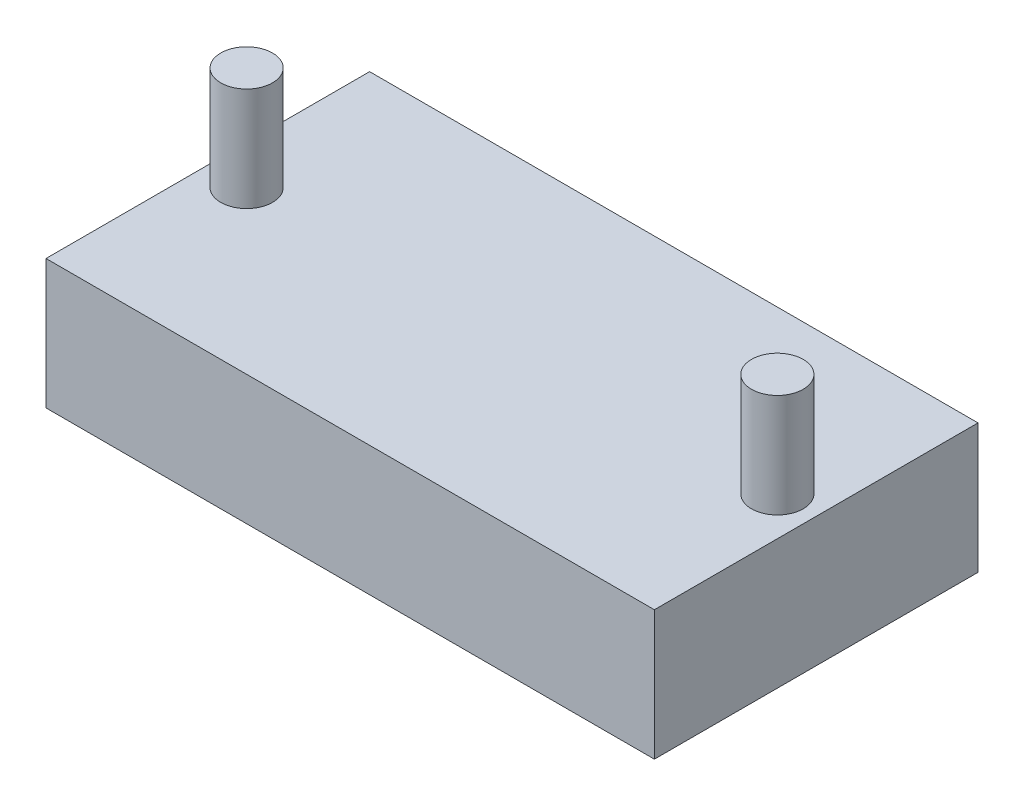
ISO-10303-21;
HEADER;
FILE_DESCRIPTION(('STEP AP214'),'2;1');
FILE_NAME('part.step','',(''),(''),'','','');
FILE_SCHEMA(('AUTOMOTIVE_DESIGN { 1 0 10303 214 1 1 1 1 }'));
ENDSEC;
DATA;
#1=APPLICATION_CONTEXT('core data for automotive mechanical design processes');
#2=APPLICATION_PROTOCOL_DEFINITION('international standard','automotive_design',2000,#1);
#3=PRODUCT_CONTEXT('',#1,'mechanical');
#4=PRODUCT('Part','Part','',(#3));
#5=PRODUCT_RELATED_PRODUCT_CATEGORY('part','',(#4));
#6=PRODUCT_DEFINITION_FORMATION('','',#4);
#7=PRODUCT_DEFINITION_CONTEXT('part definition',#1,'design');
#8=PRODUCT_DEFINITION('design','',#6,#7);
#9=PRODUCT_DEFINITION_SHAPE('','',#8);
#10=(LENGTH_UNIT() NAMED_UNIT(*) SI_UNIT(.MILLI.,.METRE.));
#11=(NAMED_UNIT(*) PLANE_ANGLE_UNIT() SI_UNIT($,.RADIAN.));
#12=(NAMED_UNIT(*) SI_UNIT($,.STERADIAN.) SOLID_ANGLE_UNIT());
#13=UNCERTAINTY_MEASURE_WITH_UNIT(LENGTH_MEASURE(1.E-05),#10,'distance_accuracy_value','');
#14=(GEOMETRIC_REPRESENTATION_CONTEXT(3) GLOBAL_UNCERTAINTY_ASSIGNED_CONTEXT((#13)) GLOBAL_UNIT_ASSIGNED_CONTEXT((#10,
#11,#12)) REPRESENTATION_CONTEXT('',''));
#15=CARTESIAN_POINT('',(0.,0.,0.));
#16=DIRECTION('',(0.,0.,1.));
#17=DIRECTION('',(1.,0.,0.));
#18=AXIS2_PLACEMENT_3D('',#15,#16,#17);
#19=CARTESIAN_POINT('',(0.,10.,0.));
#20=DIRECTION('',(1.,0.,0.));
#21=DIRECTION('',(0.,0.,-1.));
#22=AXIS2_PLACEMENT_3D('',#19,#20,#21);
#23=PLANE('',#22);
#24=DIRECTION('',(0.,0.,1.));
#25=VECTOR('',#24,1.);
#26=CARTESIAN_POINT('',(0.,0.,0.));
#27=LINE('',#26,#25);
#28=CARTESIAN_POINT('',(0.,0.,-25.));
#29=VERTEX_POINT('',#28);
#30=CARTESIAN_POINT('',(0.,0.,0.));
#31=VERTEX_POINT('',#30);
#32=EDGE_CURVE('E115',#29,#31,#27,.T.);
#33=ORIENTED_EDGE('',*,*,#32,.T.);
#34=DIRECTION('',(0.,-1.,0.));
#35=VECTOR('',#34,1.);
#36=CARTESIAN_POINT('',(0.,10.,0.));
#37=LINE('',#36,#35);
#38=CARTESIAN_POINT('',(0.,10.,0.));
#39=VERTEX_POINT('',#38);
#40=EDGE_CURVE('E104',#39,#31,#37,.T.);
#41=ORIENTED_EDGE('',*,*,#40,.F.);
#42=DIRECTION('',(0.,0.,1.));
#43=VECTOR('',#42,1.);
#44=CARTESIAN_POINT('',(0.,10.,0.));
#45=LINE('',#44,#43);
#46=CARTESIAN_POINT('',(0.,10.,-25.));
#47=VERTEX_POINT('',#46);
#48=EDGE_CURVE('E96',#47,#39,#45,.T.);
#49=ORIENTED_EDGE('',*,*,#48,.F.);
#50=DIRECTION('',(0.,-1.,0.));
#51=VECTOR('',#50,1.);
#52=CARTESIAN_POINT('',(0.,10.,-25.));
#53=LINE('',#52,#51);
#54=EDGE_CURVE('E111',#47,#29,#53,.T.);
#55=ORIENTED_EDGE('',*,*,#54,.T.);
#56=EDGE_LOOP('',(#33,#41,#49,#55));
#57=FACE_BOUND('',#56,.T.);
#58=ADVANCED_FACE('F43',(#57),#23,.F.);
#59=CARTESIAN_POINT('',(0.,10.,0.));
#60=DIRECTION('',(0.,0.,-1.));
#61=DIRECTION('',(-1.,0.,0.));
#62=AXIS2_PLACEMENT_3D('',#59,#60,#61);
#63=PLANE('',#62);
#64=DIRECTION('',(1.,0.,0.));
#65=VECTOR('',#64,1.);
#66=CARTESIAN_POINT('',(0.,0.,0.));
#67=LINE('',#66,#65);
#68=CARTESIAN_POINT('',(47.,0.,0.));
#69=VERTEX_POINT('',#68);
#70=EDGE_CURVE('E102',#31,#69,#67,.T.);
#71=ORIENTED_EDGE('',*,*,#70,.T.);
#72=DIRECTION('',(0.,-1.,0.));
#73=VECTOR('',#72,1.);
#74=CARTESIAN_POINT('',(47.,10.,0.));
#75=LINE('',#74,#73);
#76=CARTESIAN_POINT('',(47.,10.,0.));
#77=VERTEX_POINT('',#76);
#78=EDGE_CURVE('E100',#77,#69,#75,.T.);
#79=ORIENTED_EDGE('',*,*,#78,.F.);
#80=DIRECTION('',(1.,0.,0.));
#81=VECTOR('',#80,1.);
#82=CARTESIAN_POINT('',(0.,10.,0.));
#83=LINE('',#82,#81);
#84=EDGE_CURVE('E91',#39,#77,#83,.T.);
#85=ORIENTED_EDGE('',*,*,#84,.F.);
#86=ORIENTED_EDGE('',*,*,#40,.T.);
#87=EDGE_LOOP('',(#71,#79,#85,#86));
#88=FACE_BOUND('',#87,.T.);
#89=ADVANCED_FACE('F101',(#88),#63,.F.);
#90=CARTESIAN_POINT('',(47.,10.,0.));
#91=DIRECTION('',(-1.,0.,0.));
#92=DIRECTION('',(0.,0.,1.));
#93=AXIS2_PLACEMENT_3D('',#90,#91,#92);
#94=PLANE('',#93);
#95=DIRECTION('',(0.,0.,-1.));
#96=VECTOR('',#95,1.);
#97=CARTESIAN_POINT('',(47.,0.,0.));
#98=LINE('',#97,#96);
#99=CARTESIAN_POINT('',(47.,0.,-25.));
#100=VERTEX_POINT('',#99);
#101=EDGE_CURVE('E77',#69,#100,#98,.T.);
#102=ORIENTED_EDGE('',*,*,#101,.T.);
#103=DIRECTION('',(0.,-1.,0.));
#104=VECTOR('',#103,1.);
#105=CARTESIAN_POINT('',(47.,10.,-25.));
#106=LINE('',#105,#104);
#107=CARTESIAN_POINT('',(47.,10.,-25.));
#108=VERTEX_POINT('',#107);
#109=EDGE_CURVE('E105',#108,#100,#106,.T.);
#110=ORIENTED_EDGE('',*,*,#109,.F.);
#111=DIRECTION('',(0.,0.,-1.));
#112=VECTOR('',#111,1.);
#113=CARTESIAN_POINT('',(47.,10.,0.));
#114=LINE('',#113,#112);
#115=EDGE_CURVE('E94',#77,#108,#114,.T.);
#116=ORIENTED_EDGE('',*,*,#115,.F.);
#117=ORIENTED_EDGE('',*,*,#78,.T.);
#118=EDGE_LOOP('',(#102,#110,#116,#117));
#119=FACE_BOUND('',#118,.T.);
#120=ADVANCED_FACE('F107',(#119),#94,.F.);
#121=CARTESIAN_POINT('',(0.,10.,-25.));
#122=DIRECTION('',(0.,0.,1.));
#123=DIRECTION('',(1.,0.,0.));
#124=AXIS2_PLACEMENT_3D('',#121,#122,#123);
#125=PLANE('',#124);
#126=DIRECTION('',(-1.,0.,0.));
#127=VECTOR('',#126,1.);
#128=CARTESIAN_POINT('',(0.,0.,-25.));
#129=LINE('',#128,#127);
#130=EDGE_CURVE('E83',#100,#29,#129,.T.);
#131=ORIENTED_EDGE('',*,*,#130,.T.);
#132=ORIENTED_EDGE('',*,*,#54,.F.);
#133=DIRECTION('',(-1.,0.,0.));
#134=VECTOR('',#133,1.);
#135=CARTESIAN_POINT('',(0.,10.,-25.));
#136=LINE('',#135,#134);
#137=EDGE_CURVE('E60',#108,#47,#136,.T.);
#138=ORIENTED_EDGE('',*,*,#137,.F.);
#139=ORIENTED_EDGE('',*,*,#109,.T.);
#140=EDGE_LOOP('',(#131,#132,#138,#139));
#141=FACE_BOUND('',#140,.T.);
#142=ADVANCED_FACE('F139',(#141),#125,.F.);
#143=CARTESIAN_POINT('',(0.,10.,0.));
#144=DIRECTION('',(0.,-1.,0.));
#145=DIRECTION('',(0.,0.,-1.));
#146=AXIS2_PLACEMENT_3D('',#143,#144,#145);
#147=PLANE('',#146);
#148=CARTESIAN_POINT('',(44.,10.,-12.5));
#149=DIRECTION('',(0.,-1.,0.));
#150=DIRECTION('',(0.,0.,-1.));
#151=AXIS2_PLACEMENT_3D('',#148,#149,#150);
#152=CIRCLE('',#151,2.);
#153=CARTESIAN_POINT('',(44.,10.,-14.5));
#154=VERTEX_POINT('',#153);
#155=EDGE_CURVE('E11',#154,#154,#152,.F.);
#156=ORIENTED_EDGE('',*,*,#155,.F.);
#157=EDGE_LOOP('',(#156));
#158=FACE_BOUND('',#157,.T.);
#159=CARTESIAN_POINT('',(3.,10.,-12.5));
#160=DIRECTION('',(0.,-1.,0.));
#161=DIRECTION('',(0.,0.,-1.));
#162=AXIS2_PLACEMENT_3D('',#159,#160,#161);
#163=CIRCLE('',#162,2.);
#164=CARTESIAN_POINT('',(3.,10.,-14.5));
#165=VERTEX_POINT('',#164);
#166=EDGE_CURVE('E52',#165,#165,#163,.F.);
#167=ORIENTED_EDGE('',*,*,#166,.F.);
#168=EDGE_LOOP('',(#167));
#169=FACE_BOUND('',#168,.T.);
#170=ORIENTED_EDGE('',*,*,#48,.T.);
#171=ORIENTED_EDGE('',*,*,#84,.T.);
#172=ORIENTED_EDGE('',*,*,#115,.T.);
#173=ORIENTED_EDGE('',*,*,#137,.T.);
#174=EDGE_LOOP('',(#170,#171,#172,#173));
#175=FACE_BOUND('',#174,.T.);
#176=ADVANCED_FACE('F92',(#158,#169,#175),#147,.F.);
#177=CARTESIAN_POINT('',(0.,0.,0.));
#178=DIRECTION('',(0.,-1.,0.));
#179=DIRECTION('',(0.,0.,-1.));
#180=AXIS2_PLACEMENT_3D('',#177,#178,#179);
#181=PLANE('',#180);
#182=ORIENTED_EDGE('',*,*,#32,.F.);
#183=ORIENTED_EDGE('',*,*,#130,.F.);
#184=ORIENTED_EDGE('',*,*,#101,.F.);
#185=ORIENTED_EDGE('',*,*,#70,.F.);
#186=EDGE_LOOP('',(#182,#183,#184,#185));
#187=FACE_BOUND('',#186,.T.);
#188=ADVANCED_FACE('F138',(#187),#181,.T.);
#189=CARTESIAN_POINT('',(3.,18.,-12.5));
#190=DIRECTION('',(0.,-1.,0.));
#191=DIRECTION('',(0.,0.,-1.));
#192=AXIS2_PLACEMENT_3D('',#189,#190,#191);
#193=CYLINDRICAL_SURFACE('',#192,2.);
#194=CARTESIAN_POINT('',(3.,18.,-12.5));
#195=DIRECTION('',(0.,1.,0.));
#196=DIRECTION('',(0.,0.,1.));
#197=AXIS2_PLACEMENT_3D('',#194,#195,#196);
#198=CIRCLE('',#197,2.);
#199=CARTESIAN_POINT('',(3.,18.,-10.5));
#200=VERTEX_POINT('',#199);
#201=EDGE_CURVE('E119',#200,#200,#198,.T.);
#202=ORIENTED_EDGE('',*,*,#201,.F.);
#203=EDGE_LOOP('',(#202));
#204=FACE_BOUND('',#203,.T.);
#205=ORIENTED_EDGE('',*,*,#166,.T.);
#206=EDGE_LOOP('',(#205));
#207=FACE_BOUND('',#206,.T.);
#208=ADVANCED_FACE('F135',(#204,#207),#193,.T.);
#209=CARTESIAN_POINT('',(3.,18.,-12.5));
#210=DIRECTION('',(0.,1.,0.));
#211=DIRECTION('',(0.,0.,1.));
#212=AXIS2_PLACEMENT_3D('',#209,#210,#211);
#213=PLANE('',#212);
#214=ORIENTED_EDGE('',*,*,#201,.T.);
#215=EDGE_LOOP('',(#214));
#216=FACE_BOUND('',#215,.T.);
#217=ADVANCED_FACE('F172',(#216),#213,.T.);
#218=CARTESIAN_POINT('',(44.,18.,-12.5));
#219=DIRECTION('',(0.,-1.,0.));
#220=DIRECTION('',(0.,0.,-1.));
#221=AXIS2_PLACEMENT_3D('',#218,#219,#220);
#222=CYLINDRICAL_SURFACE('',#221,2.);
#223=CARTESIAN_POINT('',(44.,18.,-12.5));
#224=DIRECTION('',(0.,1.,0.));
#225=DIRECTION('',(0.,0.,-1.));
#226=AXIS2_PLACEMENT_3D('',#223,#224,#225);
#227=CIRCLE('',#226,2.);
#228=CARTESIAN_POINT('',(44.,18.,-14.5));
#229=VERTEX_POINT('',#228);
#230=EDGE_CURVE('E162',#229,#229,#227,.T.);
#231=ORIENTED_EDGE('',*,*,#230,.F.);
#232=EDGE_LOOP('',(#231));
#233=FACE_BOUND('',#232,.T.);
#234=ORIENTED_EDGE('',*,*,#155,.T.);
#235=EDGE_LOOP('',(#234));
#236=FACE_BOUND('',#235,.T.);
#237=ADVANCED_FACE('F169',(#233,#236),#222,.T.);
#238=CARTESIAN_POINT('',(44.,18.,-12.5));
#239=DIRECTION('',(0.,-1.,0.));
#240=DIRECTION('',(0.,0.,-1.));
#241=AXIS2_PLACEMENT_3D('',#238,#239,#240);
#242=PLANE('',#241);
#243=ORIENTED_EDGE('',*,*,#230,.T.);
#244=EDGE_LOOP('',(#243));
#245=FACE_BOUND('',#244,.T.);
#246=ADVANCED_FACE('F167',(#245),#242,.F.);
#247=CLOSED_SHELL('',(#58,#89,#120,#142,#176,#188,#208,#217,#237,#246));
#248=MANIFOLD_SOLID_BREP('B2',#247);
#249=ADVANCED_BREP_SHAPE_REPRESENTATION('',(#18,#248),#14);
#250=SHAPE_DEFINITION_REPRESENTATION(#9,#249);
ENDSEC;
END-ISO-10303-21;
